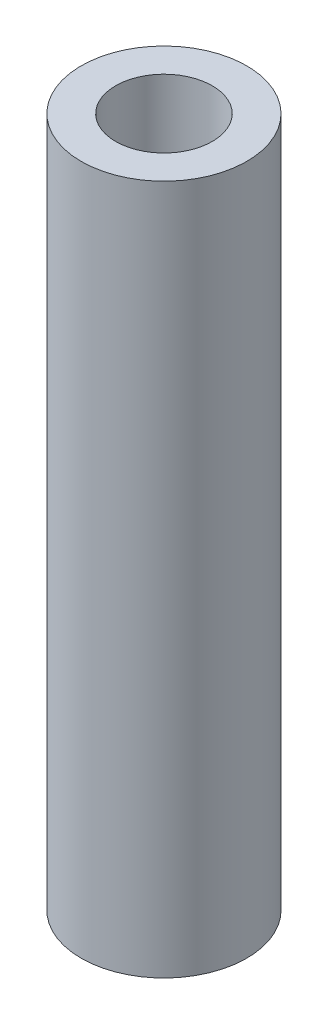
ISO-10303-21;
HEADER;
FILE_DESCRIPTION(('STEP AP214'),'2;1');
FILE_NAME('part.step','',(''),(''),'','','');
FILE_SCHEMA(('AUTOMOTIVE_DESIGN { 1 0 10303 214 1 1 1 1 }'));
ENDSEC;
DATA;
#1=APPLICATION_CONTEXT('core data for automotive mechanical design processes');
#2=APPLICATION_PROTOCOL_DEFINITION('international standard','automotive_design',2000,#1);
#3=PRODUCT_CONTEXT('',#1,'mechanical');
#4=PRODUCT('Part','Part','',(#3));
#5=PRODUCT_RELATED_PRODUCT_CATEGORY('part','',(#4));
#6=PRODUCT_DEFINITION_FORMATION('','',#4);
#7=PRODUCT_DEFINITION_CONTEXT('part definition',#1,'design');
#8=PRODUCT_DEFINITION('design','',#6,#7);
#9=PRODUCT_DEFINITION_SHAPE('','',#8);
#10=(LENGTH_UNIT() NAMED_UNIT(*) SI_UNIT(.MILLI.,.METRE.));
#11=(NAMED_UNIT(*) PLANE_ANGLE_UNIT() SI_UNIT($,.RADIAN.));
#12=(NAMED_UNIT(*) SI_UNIT($,.STERADIAN.) SOLID_ANGLE_UNIT());
#13=UNCERTAINTY_MEASURE_WITH_UNIT(LENGTH_MEASURE(1.E-05),#10,'distance_accuracy_value','');
#14=(GEOMETRIC_REPRESENTATION_CONTEXT(3) GLOBAL_UNCERTAINTY_ASSIGNED_CONTEXT((#13)) GLOBAL_UNIT_ASSIGNED_CONTEXT((#10,
#11,#12)) REPRESENTATION_CONTEXT('',''));
#15=CARTESIAN_POINT('',(0.,0.,0.));
#16=DIRECTION('',(0.,0.,1.));
#17=DIRECTION('',(1.,0.,0.));
#18=AXIS2_PLACEMENT_3D('',#15,#16,#17);
#19=CARTESIAN_POINT('',(0.,50.,0.));
#20=DIRECTION('',(0.,1.,0.));
#21=DIRECTION('',(0.,0.,1.));
#22=AXIS2_PLACEMENT_3D('',#19,#20,#21);
#23=PLANE('',#22);
#24=CARTESIAN_POINT('',(0.,50.,0.));
#25=DIRECTION('',(0.,1.,0.));
#26=DIRECTION('',(0.,0.,1.));
#27=AXIS2_PLACEMENT_3D('',#24,#25,#26);
#28=CIRCLE('',#27,6.);
#29=CARTESIAN_POINT('',(0.,50.,6.));
#30=VERTEX_POINT('',#29);
#31=EDGE_CURVE('E12',#30,#30,#28,.T.);
#32=ORIENTED_EDGE('',*,*,#31,.T.);
#33=EDGE_LOOP('',(#32));
#34=FACE_BOUND('',#33,.T.);
#35=CARTESIAN_POINT('',(0.,50.,0.));
#36=DIRECTION('',(0.,1.,0.));
#37=DIRECTION('',(0.,0.,1.));
#38=AXIS2_PLACEMENT_3D('',#35,#36,#37);
#39=CIRCLE('',#38,3.5);
#40=CARTESIAN_POINT('',(0.,50.,3.5));
#41=VERTEX_POINT('',#40);
#42=EDGE_CURVE('E53',#41,#41,#39,.T.);
#43=ORIENTED_EDGE('',*,*,#42,.F.);
#44=EDGE_LOOP('',(#43));
#45=FACE_BOUND('',#44,.T.);
#46=ADVANCED_FACE('F42',(#34,#45),#23,.T.);
#47=CARTESIAN_POINT('',(0.,0.,0.));
#48=DIRECTION('',(0.,1.,0.));
#49=DIRECTION('',(0.,0.,1.));
#50=AXIS2_PLACEMENT_3D('',#47,#48,#49);
#51=PLANE('',#50);
#52=CARTESIAN_POINT('',(0.,0.,0.));
#53=DIRECTION('',(0.,1.,0.));
#54=DIRECTION('',(0.,0.,1.));
#55=AXIS2_PLACEMENT_3D('',#52,#53,#54);
#56=CIRCLE('',#55,6.);
#57=CARTESIAN_POINT('',(0.,0.,6.));
#58=VERTEX_POINT('',#57);
#59=EDGE_CURVE('E46',#58,#58,#56,.T.);
#60=ORIENTED_EDGE('',*,*,#59,.F.);
#61=EDGE_LOOP('',(#60));
#62=FACE_BOUND('',#61,.T.);
#63=CARTESIAN_POINT('',(0.,0.,0.));
#64=DIRECTION('',(0.,1.,0.));
#65=DIRECTION('',(0.,0.,1.));
#66=AXIS2_PLACEMENT_3D('',#63,#64,#65);
#67=CIRCLE('',#66,3.5);
#68=CARTESIAN_POINT('',(0.,0.,3.5));
#69=VERTEX_POINT('',#68);
#70=EDGE_CURVE('E55',#69,#69,#67,.T.);
#71=ORIENTED_EDGE('',*,*,#70,.T.);
#72=EDGE_LOOP('',(#71));
#73=FACE_BOUND('',#72,.T.);
#74=ADVANCED_FACE('F65',(#62,#73),#51,.F.);
#75=CARTESIAN_POINT('',(0.,50.,0.));
#76=DIRECTION('',(0.,-1.,0.));
#77=DIRECTION('',(0.,0.,-1.));
#78=AXIS2_PLACEMENT_3D('',#75,#76,#77);
#79=CYLINDRICAL_SURFACE('',#78,6.);
#80=ORIENTED_EDGE('',*,*,#31,.F.);
#81=EDGE_LOOP('',(#80));
#82=FACE_BOUND('',#81,.T.);
#83=ORIENTED_EDGE('',*,*,#59,.T.);
#84=EDGE_LOOP('',(#83));
#85=FACE_BOUND('',#84,.T.);
#86=ADVANCED_FACE('F44',(#82,#85),#79,.T.);
#87=CARTESIAN_POINT('',(0.,50.,0.));
#88=DIRECTION('',(0.,-1.,0.));
#89=DIRECTION('',(0.,0.,-1.));
#90=AXIS2_PLACEMENT_3D('',#87,#88,#89);
#91=CYLINDRICAL_SURFACE('',#90,3.5);
#92=ORIENTED_EDGE('',*,*,#42,.T.);
#93=EDGE_LOOP('',(#92));
#94=FACE_BOUND('',#93,.T.);
#95=ORIENTED_EDGE('',*,*,#70,.F.);
#96=EDGE_LOOP('',(#95));
#97=FACE_BOUND('',#96,.T.);
#98=ADVANCED_FACE('F61',(#94,#97),#91,.F.);
#99=CLOSED_SHELL('',(#46,#74,#86,#98));
#100=MANIFOLD_SOLID_BREP('B2',#99);
#101=ADVANCED_BREP_SHAPE_REPRESENTATION('',(#18,#100),#14);
#102=SHAPE_DEFINITION_REPRESENTATION(#9,#101);
ENDSEC;
END-ISO-10303-21;
